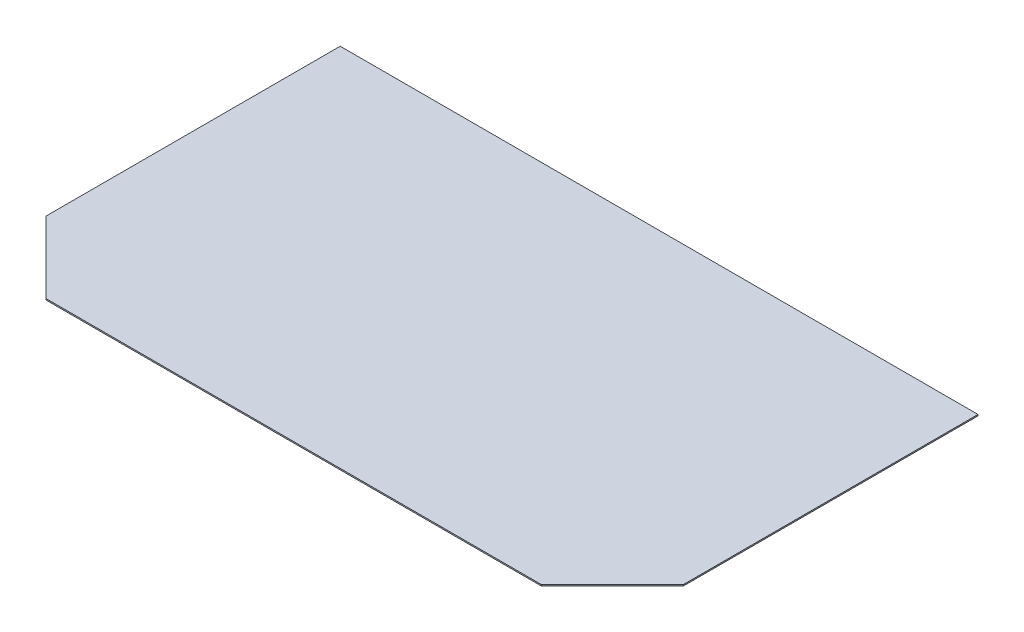
ISO-10303-21;
HEADER;
FILE_DESCRIPTION(('STEP AP214'),'2;1');
FILE_NAME('part.step','',(''),(''),'','','');
FILE_SCHEMA(('AUTOMOTIVE_DESIGN { 1 0 10303 214 1 1 1 1 }'));
ENDSEC;
DATA;
#1=APPLICATION_CONTEXT('core data for automotive mechanical design processes');
#2=APPLICATION_PROTOCOL_DEFINITION('international standard','automotive_design',2000,#1);
#3=PRODUCT_CONTEXT('',#1,'mechanical');
#4=PRODUCT('Part','Part','',(#3));
#5=PRODUCT_RELATED_PRODUCT_CATEGORY('part','',(#4));
#6=PRODUCT_DEFINITION_FORMATION('','',#4);
#7=PRODUCT_DEFINITION_CONTEXT('part definition',#1,'design');
#8=PRODUCT_DEFINITION('design','',#6,#7);
#9=PRODUCT_DEFINITION_SHAPE('','',#8);
#10=(LENGTH_UNIT() NAMED_UNIT(*) SI_UNIT(.MILLI.,.METRE.));
#11=(NAMED_UNIT(*) PLANE_ANGLE_UNIT() SI_UNIT($,.RADIAN.));
#12=(NAMED_UNIT(*) SI_UNIT($,.STERADIAN.) SOLID_ANGLE_UNIT());
#13=UNCERTAINTY_MEASURE_WITH_UNIT(LENGTH_MEASURE(1.E-05),#10,'distance_accuracy_value','');
#14=(GEOMETRIC_REPRESENTATION_CONTEXT(3) GLOBAL_UNCERTAINTY_ASSIGNED_CONTEXT((#13)) GLOBAL_UNIT_ASSIGNED_CONTEXT((#10,
#11,#12)) REPRESENTATION_CONTEXT('',''));
#15=CARTESIAN_POINT('',(0.,0.,0.));
#16=DIRECTION('',(0.,0.,1.));
#17=DIRECTION('',(1.,0.,0.));
#18=AXIS2_PLACEMENT_3D('',#15,#16,#17);
#19=CARTESIAN_POINT('',(0.,0.14,0.));
#20=DIRECTION('',(0.,0.,1.));
#21=DIRECTION('',(1.,0.,0.));
#22=AXIS2_PLACEMENT_3D('',#19,#20,#21);
#23=PLANE('',#22);
#24=DIRECTION('',(-1.,0.,0.));
#25=VECTOR('',#24,1.);
#26=CARTESIAN_POINT('',(0.,0.,0.));
#27=LINE('',#26,#25);
#28=CARTESIAN_POINT('',(68.9,0.,0.));
#29=VERTEX_POINT('',#28);
#30=CARTESIAN_POINT('',(0.,0.,0.));
#31=VERTEX_POINT('',#30);
#32=EDGE_CURVE('E116',#29,#31,#27,.T.);
#33=ORIENTED_EDGE('',*,*,#32,.T.);
#34=DIRECTION('',(0.,-1.,0.));
#35=VECTOR('',#34,1.);
#36=CARTESIAN_POINT('',(0.,0.14,0.));
#37=LINE('',#36,#35);
#38=CARTESIAN_POINT('',(0.,0.14,0.));
#39=VERTEX_POINT('',#38);
#40=EDGE_CURVE('E11',#39,#31,#37,.T.);
#41=ORIENTED_EDGE('',*,*,#40,.F.);
#42=DIRECTION('',(-1.,0.,0.));
#43=VECTOR('',#42,1.);
#44=CARTESIAN_POINT('',(0.,0.14,0.));
#45=LINE('',#44,#43);
#46=CARTESIAN_POINT('',(68.9,0.14,0.));
#47=VERTEX_POINT('',#46);
#48=EDGE_CURVE('E126',#47,#39,#45,.T.);
#49=ORIENTED_EDGE('',*,*,#48,.F.);
#50=DIRECTION('',(0.,-1.,0.));
#51=VECTOR('',#50,1.);
#52=CARTESIAN_POINT('',(68.9,0.14,0.));
#53=LINE('',#52,#51);
#54=EDGE_CURVE('E112',#47,#29,#53,.T.);
#55=ORIENTED_EDGE('',*,*,#54,.T.);
#56=EDGE_LOOP('',(#33,#41,#49,#55));
#57=FACE_BOUND('',#56,.T.);
#58=ADVANCED_FACE('F32',(#57),#23,.F.);
#59=CARTESIAN_POINT('',(0.,0.14,0.));
#60=DIRECTION('',(1.,0.,0.));
#61=DIRECTION('',(0.,0.,-1.));
#62=AXIS2_PLACEMENT_3D('',#59,#60,#61);
#63=PLANE('',#62);
#64=DIRECTION('',(0.,0.,1.));
#65=VECTOR('',#64,1.);
#66=CARTESIAN_POINT('',(0.,0.,0.));
#67=LINE('',#66,#65);
#68=CARTESIAN_POINT('',(0.,0.,31.7831353517118));
#69=VERTEX_POINT('',#68);
#70=EDGE_CURVE('E119',#31,#69,#67,.T.);
#71=ORIENTED_EDGE('',*,*,#70,.T.);
#72=DIRECTION('',(0.,-1.,0.));
#73=VECTOR('',#72,1.);
#74=CARTESIAN_POINT('',(0.,0.14,31.7831353517118));
#75=LINE('',#74,#73);
#76=CARTESIAN_POINT('',(0.,0.14,31.7831353517118));
#77=VERTEX_POINT('',#76);
#78=EDGE_CURVE('E40',#77,#69,#75,.T.);
#79=ORIENTED_EDGE('',*,*,#78,.F.);
#80=DIRECTION('',(0.,0.,1.));
#81=VECTOR('',#80,1.);
#82=CARTESIAN_POINT('',(0.,0.14,0.));
#83=LINE('',#82,#81);
#84=EDGE_CURVE('E85',#39,#77,#83,.T.);
#85=ORIENTED_EDGE('',*,*,#84,.F.);
#86=ORIENTED_EDGE('',*,*,#40,.T.);
#87=EDGE_LOOP('',(#71,#79,#85,#86));
#88=FACE_BOUND('',#87,.T.);
#89=ADVANCED_FACE('F150',(#88),#63,.F.);
#90=CARTESIAN_POINT('',(7.71686464828822,0.14,39.5));
#91=DIRECTION('',(0.707106781186547,0.,-0.707106781186548));
#92=DIRECTION('',(-0.707106781186548,0.,-0.707106781186547));
#93=AXIS2_PLACEMENT_3D('',#90,#91,#92);
#94=PLANE('',#93);
#95=DIRECTION('',(0.707106781186548,0.,0.707106781186547));
#96=VECTOR('',#95,1.);
#97=CARTESIAN_POINT('',(7.71686464828822,0.,39.5));
#98=LINE('',#97,#96);
#99=CARTESIAN_POINT('',(7.71686464828822,0.,39.5));
#100=VERTEX_POINT('',#99);
#101=EDGE_CURVE('E121',#69,#100,#98,.T.);
#102=ORIENTED_EDGE('',*,*,#101,.T.);
#103=DIRECTION('',(0.,-1.,0.));
#104=VECTOR('',#103,1.);
#105=CARTESIAN_POINT('',(7.71686464828822,0.14,39.5));
#106=LINE('',#105,#104);
#107=CARTESIAN_POINT('',(7.71686464828822,0.14,39.5));
#108=VERTEX_POINT('',#107);
#109=EDGE_CURVE('E107',#108,#100,#106,.T.);
#110=ORIENTED_EDGE('',*,*,#109,.F.);
#111=DIRECTION('',(0.707106781186548,0.,0.707106781186547));
#112=VECTOR('',#111,1.);
#113=CARTESIAN_POINT('',(7.71686464828822,0.14,39.5));
#114=LINE('',#113,#112);
#115=EDGE_CURVE('E98',#77,#108,#114,.T.);
#116=ORIENTED_EDGE('',*,*,#115,.F.);
#117=ORIENTED_EDGE('',*,*,#78,.T.);
#118=EDGE_LOOP('',(#102,#110,#116,#117));
#119=FACE_BOUND('',#118,.T.);
#120=ADVANCED_FACE('F132',(#119),#94,.F.);
#121=CARTESIAN_POINT('',(61.1831353517119,0.14,39.5));
#122=DIRECTION('',(0.,0.,-1.));
#123=DIRECTION('',(-1.,0.,0.));
#124=AXIS2_PLACEMENT_3D('',#121,#122,#123);
#125=PLANE('',#124);
#126=DIRECTION('',(1.,0.,0.));
#127=VECTOR('',#126,1.);
#128=CARTESIAN_POINT('',(61.1831353517119,0.,39.5));
#129=LINE('',#128,#127);
#130=CARTESIAN_POINT('',(61.1831353517119,0.,39.5));
#131=VERTEX_POINT('',#130);
#132=EDGE_CURVE('E106',#100,#131,#129,.T.);
#133=ORIENTED_EDGE('',*,*,#132,.T.);
#134=DIRECTION('',(0.,-1.,0.));
#135=VECTOR('',#134,1.);
#136=CARTESIAN_POINT('',(61.1831353517119,0.14,39.5));
#137=LINE('',#136,#135);
#138=CARTESIAN_POINT('',(61.1831353517119,0.14,39.5));
#139=VERTEX_POINT('',#138);
#140=EDGE_CURVE('E103',#139,#131,#137,.T.);
#141=ORIENTED_EDGE('',*,*,#140,.F.);
#142=DIRECTION('',(1.,0.,0.));
#143=VECTOR('',#142,1.);
#144=CARTESIAN_POINT('',(61.1831353517119,0.14,39.5));
#145=LINE('',#144,#143);
#146=EDGE_CURVE('E92',#108,#139,#145,.T.);
#147=ORIENTED_EDGE('',*,*,#146,.F.);
#148=ORIENTED_EDGE('',*,*,#109,.T.);
#149=EDGE_LOOP('',(#133,#141,#147,#148));
#150=FACE_BOUND('',#149,.T.);
#151=ADVANCED_FACE('F104',(#150),#125,.F.);
#152=CARTESIAN_POINT('',(68.9,0.14,31.7831353517118));
#153=DIRECTION('',(-0.707106781186552,0.,-0.707106781186543));
#154=DIRECTION('',(-0.707106781186543,0.,0.707106781186552));
#155=AXIS2_PLACEMENT_3D('',#152,#153,#154);
#156=PLANE('',#155);
#157=DIRECTION('',(0.707106781186543,0.,-0.707106781186552));
#158=VECTOR('',#157,1.);
#159=CARTESIAN_POINT('',(68.9,0.,31.7831353517118));
#160=LINE('',#159,#158);
#161=CARTESIAN_POINT('',(68.9,0.,31.7831353517118));
#162=VERTEX_POINT('',#161);
#163=EDGE_CURVE('E71',#131,#162,#160,.T.);
#164=ORIENTED_EDGE('',*,*,#163,.T.);
#165=DIRECTION('',(0.,-1.,0.));
#166=VECTOR('',#165,1.);
#167=CARTESIAN_POINT('',(68.9,0.14,31.7831353517118));
#168=LINE('',#167,#166);
#169=CARTESIAN_POINT('',(68.9,0.14,31.7831353517118));
#170=VERTEX_POINT('',#169);
#171=EDGE_CURVE('E108',#170,#162,#168,.T.);
#172=ORIENTED_EDGE('',*,*,#171,.F.);
#173=DIRECTION('',(0.707106781186543,0.,-0.707106781186552));
#174=VECTOR('',#173,1.);
#175=CARTESIAN_POINT('',(68.9,0.14,31.7831353517118));
#176=LINE('',#175,#174);
#177=EDGE_CURVE('E96',#139,#170,#176,.T.);
#178=ORIENTED_EDGE('',*,*,#177,.F.);
#179=ORIENTED_EDGE('',*,*,#140,.T.);
#180=EDGE_LOOP('',(#164,#172,#178,#179));
#181=FACE_BOUND('',#180,.T.);
#182=ADVANCED_FACE('F110',(#181),#156,.F.);
#183=CARTESIAN_POINT('',(68.9,0.14,0.));
#184=DIRECTION('',(-1.,0.,0.));
#185=DIRECTION('',(0.,0.,1.));
#186=AXIS2_PLACEMENT_3D('',#183,#184,#185);
#187=PLANE('',#186);
#188=DIRECTION('',(0.,0.,-1.));
#189=VECTOR('',#188,1.);
#190=CARTESIAN_POINT('',(68.9,0.,0.));
#191=LINE('',#190,#189);
#192=EDGE_CURVE('E77',#162,#29,#191,.T.);
#193=ORIENTED_EDGE('',*,*,#192,.T.);
#194=ORIENTED_EDGE('',*,*,#54,.F.);
#195=DIRECTION('',(0.,0.,-1.));
#196=VECTOR('',#195,1.);
#197=CARTESIAN_POINT('',(68.9,0.14,0.));
#198=LINE('',#197,#196);
#199=EDGE_CURVE('E48',#170,#47,#198,.T.);
#200=ORIENTED_EDGE('',*,*,#199,.F.);
#201=ORIENTED_EDGE('',*,*,#171,.T.);
#202=EDGE_LOOP('',(#193,#194,#200,#201));
#203=FACE_BOUND('',#202,.T.);
#204=ADVANCED_FACE('F139',(#203),#187,.F.);
#205=CARTESIAN_POINT('',(68.9,0.14,0.));
#206=DIRECTION('',(0.,-1.,0.));
#207=DIRECTION('',(0.,0.,-1.));
#208=AXIS2_PLACEMENT_3D('',#205,#206,#207);
#209=PLANE('',#208);
#210=ORIENTED_EDGE('',*,*,#48,.T.);
#211=ORIENTED_EDGE('',*,*,#84,.T.);
#212=ORIENTED_EDGE('',*,*,#115,.T.);
#213=ORIENTED_EDGE('',*,*,#146,.T.);
#214=ORIENTED_EDGE('',*,*,#177,.T.);
#215=ORIENTED_EDGE('',*,*,#199,.T.);
#216=EDGE_LOOP('',(#210,#211,#212,#213,#214,#215));
#217=FACE_BOUND('',#216,.T.);
#218=ADVANCED_FACE('F94',(#217),#209,.F.);
#219=CARTESIAN_POINT('',(68.9,0.,0.));
#220=DIRECTION('',(0.,-1.,0.));
#221=DIRECTION('',(0.,0.,-1.));
#222=AXIS2_PLACEMENT_3D('',#219,#220,#221);
#223=PLANE('',#222);
#224=ORIENTED_EDGE('',*,*,#32,.F.);
#225=ORIENTED_EDGE('',*,*,#192,.F.);
#226=ORIENTED_EDGE('',*,*,#163,.F.);
#227=ORIENTED_EDGE('',*,*,#132,.F.);
#228=ORIENTED_EDGE('',*,*,#101,.F.);
#229=ORIENTED_EDGE('',*,*,#70,.F.);
#230=EDGE_LOOP('',(#224,#225,#226,#227,#228,#229));
#231=FACE_BOUND('',#230,.T.);
#232=ADVANCED_FACE('F135',(#231),#223,.T.);
#233=CLOSED_SHELL('',(#58,#89,#120,#151,#182,#204,#218,#232));
#234=MANIFOLD_SOLID_BREP('B2',#233);
#235=ADVANCED_BREP_SHAPE_REPRESENTATION('',(#18,#234),#14);
#236=SHAPE_DEFINITION_REPRESENTATION(#9,#235);
ENDSEC;
END-ISO-10303-21;
